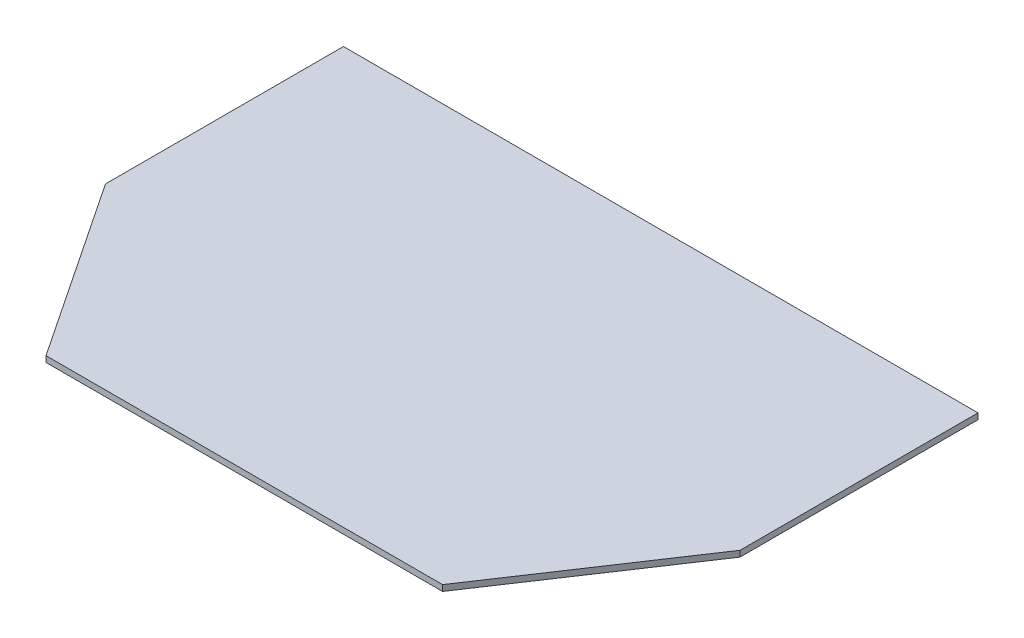
ISO-10303-21;
HEADER;
FILE_DESCRIPTION(('STEP AP214'),'2;1');
FILE_NAME('part.step','',(''),(''),'','','');
FILE_SCHEMA(('AUTOMOTIVE_DESIGN { 1 0 10303 214 1 1 1 1 }'));
ENDSEC;
DATA;
#1=APPLICATION_CONTEXT('core data for automotive mechanical design processes');
#2=APPLICATION_PROTOCOL_DEFINITION('international standard','automotive_design',2000,#1);
#3=PRODUCT_CONTEXT('',#1,'mechanical');
#4=PRODUCT('Part','Part','',(#3));
#5=PRODUCT_RELATED_PRODUCT_CATEGORY('part','',(#4));
#6=PRODUCT_DEFINITION_FORMATION('','',#4);
#7=PRODUCT_DEFINITION_CONTEXT('part definition',#1,'design');
#8=PRODUCT_DEFINITION('design','',#6,#7);
#9=PRODUCT_DEFINITION_SHAPE('','',#8);
#10=(LENGTH_UNIT() NAMED_UNIT(*) SI_UNIT(.MILLI.,.METRE.));
#11=(NAMED_UNIT(*) PLANE_ANGLE_UNIT() SI_UNIT($,.RADIAN.));
#12=(NAMED_UNIT(*) SI_UNIT($,.STERADIAN.) SOLID_ANGLE_UNIT());
#13=UNCERTAINTY_MEASURE_WITH_UNIT(LENGTH_MEASURE(1.E-05),#10,'distance_accuracy_value','');
#14=(GEOMETRIC_REPRESENTATION_CONTEXT(3) GLOBAL_UNCERTAINTY_ASSIGNED_CONTEXT((#13)) GLOBAL_UNIT_ASSIGNED_CONTEXT((#10,
#11,#12)) REPRESENTATION_CONTEXT('',''));
#15=CARTESIAN_POINT('',(0.,0.,0.));
#16=DIRECTION('',(0.,0.,1.));
#17=DIRECTION('',(1.,0.,0.));
#18=AXIS2_PLACEMENT_3D('',#15,#16,#17);
#19=CARTESIAN_POINT('',(160.,3.,60.));
#20=DIRECTION('',(-1.,0.,0.));
#21=DIRECTION('',(0.,0.,1.));
#22=AXIS2_PLACEMENT_3D('',#19,#20,#21);
#23=PLANE('',#22);
#24=DIRECTION('',(0.,0.,-1.));
#25=VECTOR('',#24,1.);
#26=CARTESIAN_POINT('',(160.,0.,60.));
#27=LINE('',#26,#25);
#28=CARTESIAN_POINT('',(160.,0.,60.));
#29=VERTEX_POINT('',#28);
#30=CARTESIAN_POINT('',(160.,0.,-60.));
#31=VERTEX_POINT('',#30);
#32=EDGE_CURVE('E117',#29,#31,#27,.T.);
#33=ORIENTED_EDGE('',*,*,#32,.T.);
#34=DIRECTION('',(0.,-1.,0.));
#35=VECTOR('',#34,1.);
#36=CARTESIAN_POINT('',(160.,3.,-60.));
#37=LINE('',#36,#35);
#38=CARTESIAN_POINT('',(160.,3.,-60.));
#39=VERTEX_POINT('',#38);
#40=EDGE_CURVE('E11',#39,#31,#37,.T.);
#41=ORIENTED_EDGE('',*,*,#40,.F.);
#42=DIRECTION('',(0.,0.,-1.));
#43=VECTOR('',#42,1.);
#44=CARTESIAN_POINT('',(160.,3.,60.));
#45=LINE('',#44,#43);
#46=CARTESIAN_POINT('',(160.,3.,60.));
#47=VERTEX_POINT('',#46);
#48=EDGE_CURVE('E127',#47,#39,#45,.T.);
#49=ORIENTED_EDGE('',*,*,#48,.F.);
#50=DIRECTION('',(0.,-1.,0.));
#51=VECTOR('',#50,1.);
#52=CARTESIAN_POINT('',(160.,3.,60.));
#53=LINE('',#52,#51);
#54=EDGE_CURVE('E113',#47,#29,#53,.T.);
#55=ORIENTED_EDGE('',*,*,#54,.T.);
#56=EDGE_LOOP('',(#33,#41,#49,#55));
#57=FACE_BOUND('',#56,.T.);
#58=ADVANCED_FACE('F33',(#57),#23,.F.);
#59=CARTESIAN_POINT('',(160.,3.,-60.));
#60=DIRECTION('',(0.,0.,1.));
#61=DIRECTION('',(1.,0.,0.));
#62=AXIS2_PLACEMENT_3D('',#59,#60,#61);
#63=PLANE('',#62);
#64=DIRECTION('',(-1.,0.,0.));
#65=VECTOR('',#64,1.);
#66=CARTESIAN_POINT('',(160.,0.,-60.));
#67=LINE('',#66,#65);
#68=CARTESIAN_POINT('',(-160.,0.,-59.9999999999999));
#69=VERTEX_POINT('',#68);
#70=EDGE_CURVE('E120',#31,#69,#67,.T.);
#71=ORIENTED_EDGE('',*,*,#70,.T.);
#72=DIRECTION('',(0.,-1.,0.));
#73=VECTOR('',#72,1.);
#74=CARTESIAN_POINT('',(-160.,3.,-59.9999999999999));
#75=LINE('',#74,#73);
#76=CARTESIAN_POINT('',(-160.,3.,-59.9999999999999));
#77=VERTEX_POINT('',#76);
#78=EDGE_CURVE('E41',#77,#69,#75,.T.);
#79=ORIENTED_EDGE('',*,*,#78,.F.);
#80=DIRECTION('',(-1.,0.,0.));
#81=VECTOR('',#80,1.);
#82=CARTESIAN_POINT('',(160.,3.,-60.));
#83=LINE('',#82,#81);
#84=EDGE_CURVE('E86',#39,#77,#83,.T.);
#85=ORIENTED_EDGE('',*,*,#84,.F.);
#86=ORIENTED_EDGE('',*,*,#40,.T.);
#87=EDGE_LOOP('',(#71,#79,#85,#86));
#88=FACE_BOUND('',#87,.T.);
#89=ADVANCED_FACE('F151',(#88),#63,.F.);
#90=CARTESIAN_POINT('',(-160.,3.,-59.9999999999999));
#91=DIRECTION('',(1.,0.,0.));
#92=DIRECTION('',(0.,0.,-1.));
#93=AXIS2_PLACEMENT_3D('',#90,#91,#92);
#94=PLANE('',#93);
#95=DIRECTION('',(0.,0.,1.));
#96=VECTOR('',#95,1.);
#97=CARTESIAN_POINT('',(-160.,0.,-59.9999999999999));
#98=LINE('',#97,#96);
#99=CARTESIAN_POINT('',(-160.,0.,60.0000000000001));
#100=VERTEX_POINT('',#99);
#101=EDGE_CURVE('E122',#69,#100,#98,.T.);
#102=ORIENTED_EDGE('',*,*,#101,.T.);
#103=DIRECTION('',(0.,-1.,0.));
#104=VECTOR('',#103,1.);
#105=CARTESIAN_POINT('',(-160.,3.,60.0000000000001));
#106=LINE('',#105,#104);
#107=CARTESIAN_POINT('',(-160.,3.,60.0000000000001));
#108=VERTEX_POINT('',#107);
#109=EDGE_CURVE('E108',#108,#100,#106,.T.);
#110=ORIENTED_EDGE('',*,*,#109,.F.);
#111=DIRECTION('',(0.,0.,1.));
#112=VECTOR('',#111,1.);
#113=CARTESIAN_POINT('',(-160.,3.,-59.9999999999999));
#114=LINE('',#113,#112);
#115=EDGE_CURVE('E99',#77,#108,#114,.T.);
#116=ORIENTED_EDGE('',*,*,#115,.F.);
#117=ORIENTED_EDGE('',*,*,#78,.T.);
#118=EDGE_LOOP('',(#102,#110,#116,#117));
#119=FACE_BOUND('',#118,.T.);
#120=ADVANCED_FACE('F133',(#119),#94,.F.);
#121=CARTESIAN_POINT('',(-160.,3.,60.0000000000001));
#122=DIRECTION('',(0.832050294337843,0.,-0.554700196225229));
#123=DIRECTION('',(-0.554700196225229,0.,-0.832050294337844));
#124=AXIS2_PLACEMENT_3D('',#121,#122,#123);
#125=PLANE('',#124);
#126=DIRECTION('',(0.554700196225229,0.,0.832050294337844));
#127=VECTOR('',#126,1.);
#128=CARTESIAN_POINT('',(-160.,0.,60.0000000000001));
#129=LINE('',#128,#127);
#130=CARTESIAN_POINT('',(-100.,0.,150.));
#131=VERTEX_POINT('',#130);
#132=EDGE_CURVE('E107',#100,#131,#129,.T.);
#133=ORIENTED_EDGE('',*,*,#132,.T.);
#134=DIRECTION('',(0.,-1.,0.));
#135=VECTOR('',#134,1.);
#136=CARTESIAN_POINT('',(-100.,3.,150.));
#137=LINE('',#136,#135);
#138=CARTESIAN_POINT('',(-100.,3.,150.));
#139=VERTEX_POINT('',#138);
#140=EDGE_CURVE('E104',#139,#131,#137,.T.);
#141=ORIENTED_EDGE('',*,*,#140,.F.);
#142=DIRECTION('',(0.554700196225229,0.,0.832050294337844));
#143=VECTOR('',#142,1.);
#144=CARTESIAN_POINT('',(-160.,3.,60.0000000000001));
#145=LINE('',#144,#143);
#146=EDGE_CURVE('E93',#108,#139,#145,.T.);
#147=ORIENTED_EDGE('',*,*,#146,.F.);
#148=ORIENTED_EDGE('',*,*,#109,.T.);
#149=EDGE_LOOP('',(#133,#141,#147,#148));
#150=FACE_BOUND('',#149,.T.);
#151=ADVANCED_FACE('F105',(#150),#125,.F.);
#152=CARTESIAN_POINT('',(-100.,3.,150.));
#153=DIRECTION('',(0.,0.,-1.));
#154=DIRECTION('',(-1.,0.,0.));
#155=AXIS2_PLACEMENT_3D('',#152,#153,#154);
#156=PLANE('',#155);
#157=DIRECTION('',(1.,0.,0.));
#158=VECTOR('',#157,1.);
#159=CARTESIAN_POINT('',(-100.,0.,150.));
#160=LINE('',#159,#158);
#161=CARTESIAN_POINT('',(100.,0.,150.));
#162=VERTEX_POINT('',#161);
#163=EDGE_CURVE('E72',#131,#162,#160,.T.);
#164=ORIENTED_EDGE('',*,*,#163,.T.);
#165=DIRECTION('',(0.,-1.,0.));
#166=VECTOR('',#165,1.);
#167=CARTESIAN_POINT('',(100.,3.,150.));
#168=LINE('',#167,#166);
#169=CARTESIAN_POINT('',(100.,3.,150.));
#170=VERTEX_POINT('',#169);
#171=EDGE_CURVE('E109',#170,#162,#168,.T.);
#172=ORIENTED_EDGE('',*,*,#171,.F.);
#173=DIRECTION('',(1.,0.,0.));
#174=VECTOR('',#173,1.);
#175=CARTESIAN_POINT('',(-100.,3.,150.));
#176=LINE('',#175,#174);
#177=EDGE_CURVE('E97',#139,#170,#176,.T.);
#178=ORIENTED_EDGE('',*,*,#177,.F.);
#179=ORIENTED_EDGE('',*,*,#140,.T.);
#180=EDGE_LOOP('',(#164,#172,#178,#179));
#181=FACE_BOUND('',#180,.T.);
#182=ADVANCED_FACE('F111',(#181),#156,.F.);
#183=CARTESIAN_POINT('',(100.,3.,150.));
#184=DIRECTION('',(-0.832050294337844,0.,-0.554700196225229));
#185=DIRECTION('',(-0.554700196225229,0.,0.832050294337844));
#186=AXIS2_PLACEMENT_3D('',#183,#184,#185);
#187=PLANE('',#186);
#188=DIRECTION('',(0.554700196225229,0.,-0.832050294337844));
#189=VECTOR('',#188,1.);
#190=CARTESIAN_POINT('',(100.,0.,150.));
#191=LINE('',#190,#189);
#192=EDGE_CURVE('E78',#162,#29,#191,.T.);
#193=ORIENTED_EDGE('',*,*,#192,.T.);
#194=ORIENTED_EDGE('',*,*,#54,.F.);
#195=DIRECTION('',(0.554700196225229,0.,-0.832050294337844));
#196=VECTOR('',#195,1.);
#197=CARTESIAN_POINT('',(100.,3.,150.));
#198=LINE('',#197,#196);
#199=EDGE_CURVE('E49',#170,#47,#198,.T.);
#200=ORIENTED_EDGE('',*,*,#199,.F.);
#201=ORIENTED_EDGE('',*,*,#171,.T.);
#202=EDGE_LOOP('',(#193,#194,#200,#201));
#203=FACE_BOUND('',#202,.T.);
#204=ADVANCED_FACE('F140',(#203),#187,.F.);
#205=CARTESIAN_POINT('',(0.,3.,0.));
#206=DIRECTION('',(0.,1.,0.));
#207=DIRECTION('',(0.,0.,1.));
#208=AXIS2_PLACEMENT_3D('',#205,#206,#207);
#209=PLANE('',#208);
#210=ORIENTED_EDGE('',*,*,#48,.T.);
#211=ORIENTED_EDGE('',*,*,#84,.T.);
#212=ORIENTED_EDGE('',*,*,#115,.T.);
#213=ORIENTED_EDGE('',*,*,#146,.T.);
#214=ORIENTED_EDGE('',*,*,#177,.T.);
#215=ORIENTED_EDGE('',*,*,#199,.T.);
#216=EDGE_LOOP('',(#210,#211,#212,#213,#214,#215));
#217=FACE_BOUND('',#216,.T.);
#218=ADVANCED_FACE('F95',(#217),#209,.T.);
#219=CARTESIAN_POINT('',(0.,0.,0.));
#220=DIRECTION('',(0.,1.,0.));
#221=DIRECTION('',(0.,0.,1.));
#222=AXIS2_PLACEMENT_3D('',#219,#220,#221);
#223=PLANE('',#222);
#224=ORIENTED_EDGE('',*,*,#32,.F.);
#225=ORIENTED_EDGE('',*,*,#192,.F.);
#226=ORIENTED_EDGE('',*,*,#163,.F.);
#227=ORIENTED_EDGE('',*,*,#132,.F.);
#228=ORIENTED_EDGE('',*,*,#101,.F.);
#229=ORIENTED_EDGE('',*,*,#70,.F.);
#230=EDGE_LOOP('',(#224,#225,#226,#227,#228,#229));
#231=FACE_BOUND('',#230,.T.);
#232=ADVANCED_FACE('F136',(#231),#223,.F.);
#233=CLOSED_SHELL('',(#58,#89,#120,#151,#182,#204,#218,#232));
#234=MANIFOLD_SOLID_BREP('B2',#233);
#235=ADVANCED_BREP_SHAPE_REPRESENTATION('',(#18,#234),#14);
#236=SHAPE_DEFINITION_REPRESENTATION(#9,#235);
ENDSEC;
END-ISO-10303-21;
